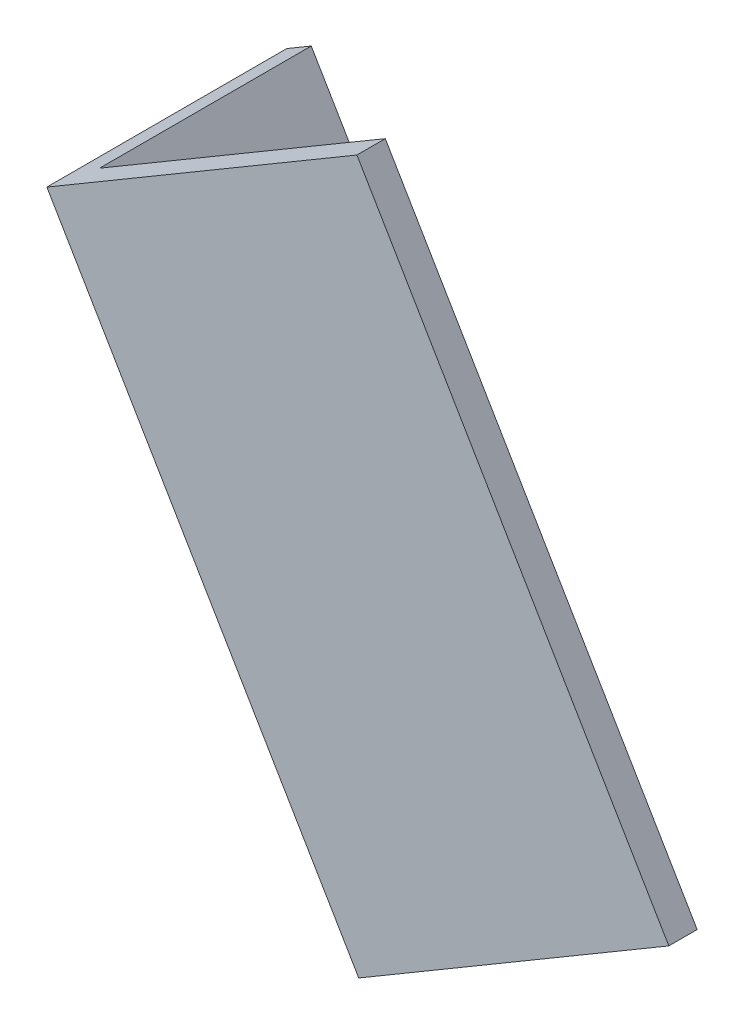
ISO-10303-21;
HEADER;
FILE_DESCRIPTION(('STEP AP214'),'2;1');
FILE_NAME('part.step','',(''),(''),'','','');
FILE_SCHEMA(('AUTOMOTIVE_DESIGN { 1 0 10303 214 1 1 1 1 }'));
ENDSEC;
DATA;
#1=APPLICATION_CONTEXT('core data for automotive mechanical design processes');
#2=APPLICATION_PROTOCOL_DEFINITION('international standard','automotive_design',2000,#1);
#3=PRODUCT_CONTEXT('',#1,'mechanical');
#4=PRODUCT('Part','Part','',(#3));
#5=PRODUCT_RELATED_PRODUCT_CATEGORY('part','',(#4));
#6=PRODUCT_DEFINITION_FORMATION('','',#4);
#7=PRODUCT_DEFINITION_CONTEXT('part definition',#1,'design');
#8=PRODUCT_DEFINITION('design','',#6,#7);
#9=PRODUCT_DEFINITION_SHAPE('','',#8);
#10=(LENGTH_UNIT() NAMED_UNIT(*) SI_UNIT(.MILLI.,.METRE.));
#11=(NAMED_UNIT(*) PLANE_ANGLE_UNIT() SI_UNIT($,.RADIAN.));
#12=(NAMED_UNIT(*) SI_UNIT($,.STERADIAN.) SOLID_ANGLE_UNIT());
#13=UNCERTAINTY_MEASURE_WITH_UNIT(LENGTH_MEASURE(1.E-05),#10,'distance_accuracy_value','');
#14=(GEOMETRIC_REPRESENTATION_CONTEXT(3) GLOBAL_UNCERTAINTY_ASSIGNED_CONTEXT((#13)) GLOBAL_UNIT_ASSIGNED_CONTEXT((#10,
#11,#12)) REPRESENTATION_CONTEXT('',''));
#15=CARTESIAN_POINT('',(0.,0.,0.));
#16=DIRECTION('',(0.,0.,1.));
#17=DIRECTION('',(1.,0.,0.));
#18=AXIS2_PLACEMENT_3D('',#15,#16,#17);
#19=CARTESIAN_POINT('',(7.00215004207638,333.81883934679,19.299999998574));
#20=DIRECTION('',(0.50786522161376,-0.86143654245406,1.64819339222928E-11));
#21=DIRECTION('',(-0.86143654245406,-0.50786522161376,-1.20055227348126E-11));
#22=AXIS2_PLACEMENT_3D('',#19,#20,#21);
#23=PLANE('',#22);
#24=DIRECTION('',(-1.84010019401672E-11,8.28468744552605E-12,1.));
#25=VECTOR('',#24,1.);
#26=CARTESIAN_POINT('',(23.4125161756477,343.493671818613,28.9999999987959));
#27=LINE('',#26,#25);
#28=CARTESIAN_POINT('',(23.4125161756477,343.493671818613,28.9999999987959));
#29=VERTEX_POINT('',#28);
#30=CARTESIAN_POINT('',(23.4125161755925,343.493671818638,31.9999999987959));
#31=VERTEX_POINT('',#30);
#32=EDGE_CURVE('E11',#29,#31,#27,.T.);
#33=ORIENTED_EDGE('',*,*,#32,.T.);
#34=DIRECTION('',(-0.861436542454061,-0.50786522161376,-1.16437908635053E-11));
#35=VECTOR('',#34,1.);
#36=CARTESIAN_POINT('',(23.4125161755925,343.493671818638,31.9999999987959));
#37=LINE('',#36,#35);
#38=CARTESIAN_POINT('',(-9.40821609190703,324.144006875153,31.9999999983523));
#39=VERTEX_POINT('',#38);
#40=EDGE_CURVE('E155',#31,#39,#37,.T.);
#41=ORIENTED_EDGE('',*,*,#40,.T.);
#42=DIRECTION('',(1.84010019401672E-11,-8.28468744552605E-12,-1.));
#43=VECTOR('',#42,1.);
#44=CARTESIAN_POINT('',(-9.40821609190703,324.144006875153,31.9999999983523));
#45=LINE('',#44,#43);
#46=CARTESIAN_POINT('',(-9.40821609143966,324.144006874943,6.59999999835233));
#47=VERTEX_POINT('',#46);
#48=EDGE_CURVE('E94',#39,#47,#45,.T.);
#49=ORIENTED_EDGE('',*,*,#48,.T.);
#50=DIRECTION('',(0.861436542454061,0.50786522161376,1.16437908635053E-11));
#51=VECTOR('',#50,1.);
#52=CARTESIAN_POINT('',(-9.40821609143966,324.144006874943,6.59999999835233));
#53=LINE('',#52,#51);
#54=CARTESIAN_POINT('',(-6.82390646407735,325.667602539784,6.59999999838725));
#55=VERTEX_POINT('',#54);
#56=EDGE_CURVE('E128',#47,#55,#53,.T.);
#57=ORIENTED_EDGE('',*,*,#56,.T.);
#58=DIRECTION('',(-1.84010019401672E-11,8.28468744552605E-12,1.));
#59=VECTOR('',#58,1.);
#60=CARTESIAN_POINT('',(-6.82390646407735,325.667602539784,6.59999999838726));
#61=LINE('',#60,#59);
#62=CARTESIAN_POINT('',(-6.82390646448952,325.667602539969,28.9999999983872));
#63=VERTEX_POINT('',#62);
#64=EDGE_CURVE('E122',#55,#63,#61,.T.);
#65=ORIENTED_EDGE('',*,*,#64,.T.);
#66=DIRECTION('',(0.861436542454061,0.50786522161376,1.16437908635053E-11));
#67=VECTOR('',#66,1.);
#68=CARTESIAN_POINT('',(-9.40821609185186,324.144006875128,28.9999999983523));
#69=LINE('',#68,#67);
#70=EDGE_CURVE('E125',#63,#29,#69,.T.);
#71=ORIENTED_EDGE('',*,*,#70,.T.);
#72=EDGE_LOOP('',(#33,#41,#49,#57,#65,#71));
#73=FACE_BOUND('',#72,.T.);
#74=ADVANCED_FACE('F49',(#73),#23,.T.);
#75=CARTESIAN_POINT('',(-26.009089362818,389.812214606304,19.2999999975028));
#76=DIRECTION('',(-0.50786522161376,0.86143654245406,-1.64819614366448E-11));
#77=DIRECTION('',(1.84010019284882E-11,-8.28468745241149E-12,-1.));
#78=AXIS2_PLACEMENT_3D('',#75,#76,#77);
#79=PLANE('',#78);
#80=DIRECTION('',(-1.84010019401672E-11,8.28468744552605E-12,1.));
#81=VECTOR('',#80,1.);
#82=CARTESIAN_POINT('',(-9.59872322924665,399.487047078127,28.9999999977247));
#83=LINE('',#82,#81);
#84=CARTESIAN_POINT('',(-9.59872322924665,399.487047078127,28.9999999977247));
#85=VERTEX_POINT('',#84);
#86=CARTESIAN_POINT('',(-9.59872322930186,399.487047078151,31.9999999977247));
#87=VERTEX_POINT('',#86);
#88=EDGE_CURVE('E60',#85,#87,#83,.T.);
#89=ORIENTED_EDGE('',*,*,#88,.F.);
#90=DIRECTION('',(0.861436542454061,0.50786522161376,1.16437908635053E-11));
#91=VECTOR('',#90,1.);
#92=CARTESIAN_POINT('',(-42.4194554967462,380.137382134642,28.999999997281));
#93=LINE('',#92,#91);
#94=CARTESIAN_POINT('',(-39.8351458693844,381.660977799484,28.999999997316));
#95=VERTEX_POINT('',#94);
#96=EDGE_CURVE('E152',#95,#85,#93,.T.);
#97=ORIENTED_EDGE('',*,*,#96,.F.);
#98=DIRECTION('',(-1.84010019401672E-11,8.28468744552605E-12,1.));
#99=VECTOR('',#98,1.);
#100=CARTESIAN_POINT('',(-39.8351458689722,381.660977799298,6.59999999731594));
#101=LINE('',#100,#99);
#102=CARTESIAN_POINT('',(-39.8351458689722,381.660977799298,6.59999999731594));
#103=VERTEX_POINT('',#102);
#104=EDGE_CURVE('E134',#103,#95,#101,.T.);
#105=ORIENTED_EDGE('',*,*,#104,.F.);
#106=DIRECTION('',(0.861436542454061,0.50786522161376,1.16437908635053E-11));
#107=VECTOR('',#106,1.);
#108=CARTESIAN_POINT('',(-42.419455496334,380.137382134456,6.59999999728101));
#109=LINE('',#108,#107);
#110=CARTESIAN_POINT('',(-42.419455496334,380.137382134456,6.59999999728101));
#111=VERTEX_POINT('',#110);
#112=EDGE_CURVE('E53',#111,#103,#109,.T.);
#113=ORIENTED_EDGE('',*,*,#112,.F.);
#114=DIRECTION('',(1.84010019401672E-11,-8.28468744552605E-12,-1.));
#115=VECTOR('',#114,1.);
#116=CARTESIAN_POINT('',(-42.4194554968014,380.137382134667,31.999999997281));
#117=LINE('',#116,#115);
#118=CARTESIAN_POINT('',(-42.4194554968014,380.137382134667,31.999999997281));
#119=VERTEX_POINT('',#118);
#120=EDGE_CURVE('E159',#119,#111,#117,.T.);
#121=ORIENTED_EDGE('',*,*,#120,.F.);
#122=DIRECTION('',(-0.861436542454061,-0.50786522161376,-1.16437908635053E-11));
#123=VECTOR('',#122,1.);
#124=CARTESIAN_POINT('',(-9.59872322930186,399.487047078151,31.9999999977247));
#125=LINE('',#124,#123);
#126=EDGE_CURVE('E85',#87,#119,#125,.T.);
#127=ORIENTED_EDGE('',*,*,#126,.F.);
#128=EDGE_LOOP('',(#89,#97,#105,#113,#121,#127));
#129=FACE_BOUND('',#128,.T.);
#130=ADVANCED_FACE('F51',(#129),#79,.T.);
#131=CARTESIAN_POINT('',(-9.59872322924665,399.487047078127,28.9999999977247));
#132=DIRECTION('',(0.86143654245406,0.50786522161376,1.16437908635053E-11));
#133=DIRECTION('',(-6.690090835073E-11,1.36403665957025E-10,-1.));
#134=AXIS2_PLACEMENT_3D('',#131,#132,#133);
#135=PLANE('',#134);
#136=ORIENTED_EDGE('',*,*,#88,.T.);
#137=DIRECTION('',(0.50786522161376,-0.861436542454061,1.64819339222928E-11));
#138=VECTOR('',#137,1.);
#139=CARTESIAN_POINT('',(-9.59872322930186,399.487047078151,31.9999999977247));
#140=LINE('',#139,#138);
#141=EDGE_CURVE('E158',#87,#31,#140,.T.);
#142=ORIENTED_EDGE('',*,*,#141,.T.);
#143=ORIENTED_EDGE('',*,*,#32,.F.);
#144=DIRECTION('',(0.50786522161376,-0.861436542454061,1.64819339222928E-11));
#145=VECTOR('',#144,1.);
#146=CARTESIAN_POINT('',(-9.59872322924665,399.487047078127,28.9999999977247));
#147=LINE('',#146,#145);
#148=EDGE_CURVE('E147',#85,#29,#147,.T.);
#149=ORIENTED_EDGE('',*,*,#148,.F.);
#150=EDGE_LOOP('',(#136,#142,#143,#149));
#151=FACE_BOUND('',#150,.T.);
#152=ADVANCED_FACE('F196',(#151),#135,.T.);
#153=CARTESIAN_POINT('',(-9.59872322930186,399.487047078151,31.9999999977247));
#154=DIRECTION('',(-1.84009879665847E-11,8.28466374365782E-12,1.));
#155=DIRECTION('',(0.860340774757118,0.509719286755291,1.16082673490432E-11));
#156=AXIS2_PLACEMENT_3D('',#153,#154,#155);
#157=PLANE('',#156);
#158=ORIENTED_EDGE('',*,*,#126,.T.);
#159=DIRECTION('',(0.50786522161376,-0.861436542454061,1.64819339222928E-11));
#160=VECTOR('',#159,1.);
#161=CARTESIAN_POINT('',(-42.4194554968014,380.137382134667,31.999999997281));
#162=LINE('',#161,#160);
#163=EDGE_CURVE('E167',#119,#39,#162,.T.);
#164=ORIENTED_EDGE('',*,*,#163,.T.);
#165=ORIENTED_EDGE('',*,*,#40,.F.);
#166=ORIENTED_EDGE('',*,*,#141,.F.);
#167=EDGE_LOOP('',(#158,#164,#165,#166));
#168=FACE_BOUND('',#167,.T.);
#169=ADVANCED_FACE('F186',(#168),#157,.T.);
#170=CARTESIAN_POINT('',(-42.4194554968014,380.137382134667,31.999999997281));
#171=DIRECTION('',(-0.86143654245406,-0.50786522161376,-1.16437908635053E-11));
#172=DIRECTION('',(-1.84010019401524E-11,8.28468744550089E-12,1.));
#173=AXIS2_PLACEMENT_3D('',#170,#171,#172);
#174=PLANE('',#173);
#175=ORIENTED_EDGE('',*,*,#120,.T.);
#176=DIRECTION('',(0.50786522161376,-0.861436542454061,1.64819339222928E-11));
#177=VECTOR('',#176,1.);
#178=CARTESIAN_POINT('',(-42.419455496334,380.137382134456,6.59999999728101));
#179=LINE('',#178,#177);
#180=EDGE_CURVE('E162',#111,#47,#179,.T.);
#181=ORIENTED_EDGE('',*,*,#180,.T.);
#182=ORIENTED_EDGE('',*,*,#48,.F.);
#183=ORIENTED_EDGE('',*,*,#163,.F.);
#184=EDGE_LOOP('',(#175,#181,#182,#183));
#185=FACE_BOUND('',#184,.T.);
#186=ADVANCED_FACE('F189',(#185),#174,.T.);
#187=CARTESIAN_POINT('',(-42.419455496334,380.137382134456,6.59999999728101));
#188=DIRECTION('',(1.84009879665847E-11,-8.28466374365782E-12,-1.));
#189=DIRECTION('',(-0.860340774757118,-0.509719286755291,-1.16082673490432E-11));
#190=AXIS2_PLACEMENT_3D('',#187,#188,#189);
#191=PLANE('',#190);
#192=ORIENTED_EDGE('',*,*,#112,.T.);
#193=DIRECTION('',(0.50786522161376,-0.861436542454061,1.64819339222928E-11));
#194=VECTOR('',#193,1.);
#195=CARTESIAN_POINT('',(-39.8351458689722,381.660977799298,6.59999999731594));
#196=LINE('',#195,#194);
#197=EDGE_CURVE('E133',#103,#55,#196,.T.);
#198=ORIENTED_EDGE('',*,*,#197,.T.);
#199=ORIENTED_EDGE('',*,*,#56,.F.);
#200=ORIENTED_EDGE('',*,*,#180,.F.);
#201=EDGE_LOOP('',(#192,#198,#199,#200));
#202=FACE_BOUND('',#201,.T.);
#203=ADVANCED_FACE('F193',(#202),#191,.T.);
#204=CARTESIAN_POINT('',(-39.8351458689722,381.660977799298,6.59999999731594));
#205=DIRECTION('',(0.86143654245406,0.50786522161376,1.16437908635053E-11));
#206=DIRECTION('',(-6.690090835073E-11,1.36403665957025E-10,-1.));
#207=AXIS2_PLACEMENT_3D('',#204,#205,#206);
#208=PLANE('',#207);
#209=ORIENTED_EDGE('',*,*,#104,.T.);
#210=DIRECTION('',(0.50786522161376,-0.861436542454061,1.64819339222928E-11));
#211=VECTOR('',#210,1.);
#212=CARTESIAN_POINT('',(-39.8351458693844,381.660977799484,28.999999997316));
#213=LINE('',#212,#211);
#214=EDGE_CURVE('E137',#95,#63,#213,.T.);
#215=ORIENTED_EDGE('',*,*,#214,.T.);
#216=ORIENTED_EDGE('',*,*,#64,.F.);
#217=ORIENTED_EDGE('',*,*,#197,.F.);
#218=EDGE_LOOP('',(#209,#215,#216,#217));
#219=FACE_BOUND('',#218,.T.);
#220=ADVANCED_FACE('F138',(#219),#208,.T.);
#221=CARTESIAN_POINT('',(-39.8351458693844,381.660977799484,28.999999997316));
#222=DIRECTION('',(1.84009879665847E-11,-8.28466374365782E-12,-1.));
#223=DIRECTION('',(-0.860340774757118,-0.509719286755291,-1.16082673490432E-11));
#224=AXIS2_PLACEMENT_3D('',#221,#222,#223);
#225=PLANE('',#224);
#226=ORIENTED_EDGE('',*,*,#96,.T.);
#227=ORIENTED_EDGE('',*,*,#148,.T.);
#228=ORIENTED_EDGE('',*,*,#70,.F.);
#229=ORIENTED_EDGE('',*,*,#214,.F.);
#230=EDGE_LOOP('',(#226,#227,#228,#229));
#231=FACE_BOUND('',#230,.T.);
#232=ADVANCED_FACE('F145',(#231),#225,.T.);
#233=CLOSED_SHELL('',(#74,#130,#152,#169,#186,#203,#220,#232));
#234=MANIFOLD_SOLID_BREP('B2',#233);
#235=ADVANCED_BREP_SHAPE_REPRESENTATION('',(#18,#234),#14);
#236=SHAPE_DEFINITION_REPRESENTATION(#9,#235);
ENDSEC;
END-ISO-10303-21;
